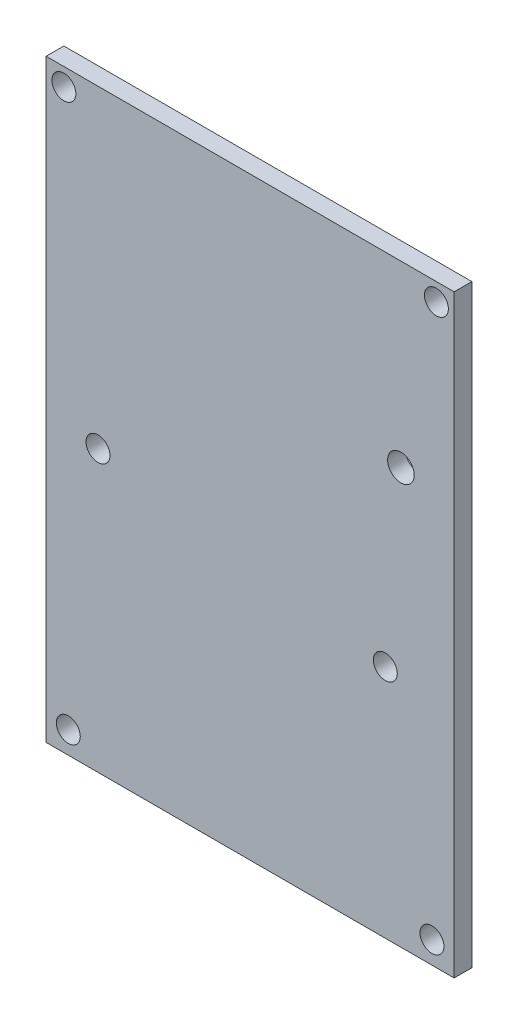
ISO-10303-21;
HEADER;
FILE_DESCRIPTION(('STEP AP214'),'2;1');
FILE_NAME('part.step','',(''),(''),'','','');
FILE_SCHEMA(('AUTOMOTIVE_DESIGN { 1 0 10303 214 1 1 1 1 }'));
ENDSEC;
DATA;
#1=APPLICATION_CONTEXT('core data for automotive mechanical design processes');
#2=APPLICATION_PROTOCOL_DEFINITION('international standard','automotive_design',2000,#1);
#3=PRODUCT_CONTEXT('',#1,'mechanical');
#4=PRODUCT('Part','Part','',(#3));
#5=PRODUCT_RELATED_PRODUCT_CATEGORY('part','',(#4));
#6=PRODUCT_DEFINITION_FORMATION('','',#4);
#7=PRODUCT_DEFINITION_CONTEXT('part definition',#1,'design');
#8=PRODUCT_DEFINITION('design','',#6,#7);
#9=PRODUCT_DEFINITION_SHAPE('','',#8);
#10=(LENGTH_UNIT() NAMED_UNIT(*) SI_UNIT(.MILLI.,.METRE.));
#11=(NAMED_UNIT(*) PLANE_ANGLE_UNIT() SI_UNIT($,.RADIAN.));
#12=(NAMED_UNIT(*) SI_UNIT($,.STERADIAN.) SOLID_ANGLE_UNIT());
#13=UNCERTAINTY_MEASURE_WITH_UNIT(LENGTH_MEASURE(1.E-05),#10,'distance_accuracy_value','');
#14=(GEOMETRIC_REPRESENTATION_CONTEXT(3) GLOBAL_UNCERTAINTY_ASSIGNED_CONTEXT((#13)) GLOBAL_UNIT_ASSIGNED_CONTEXT((#10,
#11,#12)) REPRESENTATION_CONTEXT('',''));
#15=CARTESIAN_POINT('',(0.,0.,0.));
#16=DIRECTION('',(0.,0.,1.));
#17=DIRECTION('',(1.,0.,0.));
#18=AXIS2_PLACEMENT_3D('',#15,#16,#17);
#19=CARTESIAN_POINT('',(23.,-33.5,2.));
#20=DIRECTION('',(-1.,0.,0.));
#21=DIRECTION('',(0.,0.,1.));
#22=AXIS2_PLACEMENT_3D('',#19,#20,#21);
#23=PLANE('',#22);
#24=DIRECTION('',(0.,1.,0.));
#25=VECTOR('',#24,1.);
#26=CARTESIAN_POINT('',(23.,-33.5,0.));
#27=LINE('',#26,#25);
#28=CARTESIAN_POINT('',(23.,-33.5,0.));
#29=VERTEX_POINT('',#28);
#30=CARTESIAN_POINT('',(23.,33.5,0.));
#31=VERTEX_POINT('',#30);
#32=EDGE_CURVE('E99',#29,#31,#27,.T.);
#33=ORIENTED_EDGE('',*,*,#32,.T.);
#34=DIRECTION('',(0.,0.,-1.));
#35=VECTOR('',#34,1.);
#36=CARTESIAN_POINT('',(23.,33.5,2.));
#37=LINE('',#36,#35);
#38=CARTESIAN_POINT('',(23.,33.5,2.));
#39=VERTEX_POINT('',#38);
#40=EDGE_CURVE('E11',#39,#31,#37,.T.);
#41=ORIENTED_EDGE('',*,*,#40,.F.);
#42=DIRECTION('',(0.,1.,0.));
#43=VECTOR('',#42,1.);
#44=CARTESIAN_POINT('',(23.,-33.5,2.));
#45=LINE('',#44,#43);
#46=CARTESIAN_POINT('',(23.,-33.5,2.));
#47=VERTEX_POINT('',#46);
#48=EDGE_CURVE('E87',#47,#39,#45,.T.);
#49=ORIENTED_EDGE('',*,*,#48,.F.);
#50=DIRECTION('',(0.,0.,-1.));
#51=VECTOR('',#50,1.);
#52=CARTESIAN_POINT('',(23.,-33.5,2.));
#53=LINE('',#52,#51);
#54=EDGE_CURVE('E95',#47,#29,#53,.T.);
#55=ORIENTED_EDGE('',*,*,#54,.T.);
#56=EDGE_LOOP('',(#33,#41,#49,#55));
#57=FACE_BOUND('',#56,.T.);
#58=ADVANCED_FACE('F36',(#57),#23,.F.);
#59=CARTESIAN_POINT('',(-23.,33.5,2.));
#60=DIRECTION('',(0.,-1.,0.));
#61=DIRECTION('',(0.,0.,-1.));
#62=AXIS2_PLACEMENT_3D('',#59,#60,#61);
#63=PLANE('',#62);
#64=DIRECTION('',(-1.,0.,0.));
#65=VECTOR('',#64,1.);
#66=CARTESIAN_POINT('',(-23.,33.5,0.));
#67=LINE('',#66,#65);
#68=CARTESIAN_POINT('',(-23.,33.5,0.));
#69=VERTEX_POINT('',#68);
#70=EDGE_CURVE('E91',#31,#69,#67,.T.);
#71=ORIENTED_EDGE('',*,*,#70,.T.);
#72=DIRECTION('',(0.,0.,-1.));
#73=VECTOR('',#72,1.);
#74=CARTESIAN_POINT('',(-23.,33.5,2.));
#75=LINE('',#74,#73);
#76=CARTESIAN_POINT('',(-23.,33.5,2.));
#77=VERTEX_POINT('',#76);
#78=EDGE_CURVE('E44',#77,#69,#75,.T.);
#79=ORIENTED_EDGE('',*,*,#78,.F.);
#80=DIRECTION('',(-1.,0.,0.));
#81=VECTOR('',#80,1.);
#82=CARTESIAN_POINT('',(-23.,33.5,2.));
#83=LINE('',#82,#81);
#84=EDGE_CURVE('E82',#39,#77,#83,.T.);
#85=ORIENTED_EDGE('',*,*,#84,.F.);
#86=ORIENTED_EDGE('',*,*,#40,.T.);
#87=EDGE_LOOP('',(#71,#79,#85,#86));
#88=FACE_BOUND('',#87,.T.);
#89=ADVANCED_FACE('F90',(#88),#63,.F.);
#90=CARTESIAN_POINT('',(-23.,-33.5,2.));
#91=DIRECTION('',(1.,0.,0.));
#92=DIRECTION('',(0.,0.,-1.));
#93=AXIS2_PLACEMENT_3D('',#90,#91,#92);
#94=PLANE('',#93);
#95=DIRECTION('',(0.,-1.,0.));
#96=VECTOR('',#95,1.);
#97=CARTESIAN_POINT('',(-23.,-33.5,0.));
#98=LINE('',#97,#96);
#99=CARTESIAN_POINT('',(-23.,-33.5,0.));
#100=VERTEX_POINT('',#99);
#101=EDGE_CURVE('E69',#69,#100,#98,.T.);
#102=ORIENTED_EDGE('',*,*,#101,.T.);
#103=DIRECTION('',(0.,0.,-1.));
#104=VECTOR('',#103,1.);
#105=CARTESIAN_POINT('',(-23.,-33.5,2.));
#106=LINE('',#105,#104);
#107=CARTESIAN_POINT('',(-23.,-33.5,2.));
#108=VERTEX_POINT('',#107);
#109=EDGE_CURVE('E92',#108,#100,#106,.T.);
#110=ORIENTED_EDGE('',*,*,#109,.F.);
#111=DIRECTION('',(0.,-1.,0.));
#112=VECTOR('',#111,1.);
#113=CARTESIAN_POINT('',(-23.,-33.5,2.));
#114=LINE('',#113,#112);
#115=EDGE_CURVE('E85',#77,#108,#114,.T.);
#116=ORIENTED_EDGE('',*,*,#115,.F.);
#117=ORIENTED_EDGE('',*,*,#78,.T.);
#118=EDGE_LOOP('',(#102,#110,#116,#117));
#119=FACE_BOUND('',#118,.T.);
#120=ADVANCED_FACE('F93',(#119),#94,.F.);
#121=CARTESIAN_POINT('',(-23.,-33.5,2.));
#122=DIRECTION('',(0.,1.,0.));
#123=DIRECTION('',(0.,0.,1.));
#124=AXIS2_PLACEMENT_3D('',#121,#122,#123);
#125=PLANE('',#124);
#126=DIRECTION('',(1.,0.,0.));
#127=VECTOR('',#126,1.);
#128=CARTESIAN_POINT('',(-23.,-33.5,0.));
#129=LINE('',#128,#127);
#130=EDGE_CURVE('E75',#100,#29,#129,.T.);
#131=ORIENTED_EDGE('',*,*,#130,.T.);
#132=ORIENTED_EDGE('',*,*,#54,.F.);
#133=DIRECTION('',(1.,0.,0.));
#134=VECTOR('',#133,1.);
#135=CARTESIAN_POINT('',(-23.,-33.5,2.));
#136=LINE('',#135,#134);
#137=EDGE_CURVE('E52',#108,#47,#136,.T.);
#138=ORIENTED_EDGE('',*,*,#137,.F.);
#139=ORIENTED_EDGE('',*,*,#109,.T.);
#140=EDGE_LOOP('',(#131,#132,#138,#139));
#141=FACE_BOUND('',#140,.T.);
#142=ADVANCED_FACE('F107',(#141),#125,.F.);
#143=CARTESIAN_POINT('',(0.,0.,2.));
#144=DIRECTION('',(0.,0.,-1.));
#145=DIRECTION('',(-1.,0.,0.));
#146=AXIS2_PLACEMENT_3D('',#143,#144,#145);
#147=PLANE('',#146);
#148=CARTESIAN_POINT('',(17.,13.345,2.));
#149=DIRECTION('',(0.,0.,1.));
#150=DIRECTION('',(1.,0.,0.));
#151=AXIS2_PLACEMENT_3D('',#148,#149,#150);
#152=CIRCLE('',#151,1.5);
#153=CARTESIAN_POINT('',(18.5,13.345,2.));
#154=VERTEX_POINT('',#153);
#155=EDGE_CURVE('E151',#154,#154,#152,.T.);
#156=ORIENTED_EDGE('',*,*,#155,.F.);
#157=EDGE_LOOP('',(#156));
#158=FACE_BOUND('',#157,.T.);
#159=CARTESIAN_POINT('',(-21.,31.5,2.));
#160=DIRECTION('',(0.,0.,1.));
#161=DIRECTION('',(1.,0.,0.));
#162=AXIS2_PLACEMENT_3D('',#159,#160,#161);
#163=CIRCLE('',#162,1.35);
#164=CARTESIAN_POINT('',(-19.65,31.5,2.));
#165=VERTEX_POINT('',#164);
#166=EDGE_CURVE('E145',#165,#165,#163,.T.);
#167=ORIENTED_EDGE('',*,*,#166,.F.);
#168=EDGE_LOOP('',(#167));
#169=FACE_BOUND('',#168,.T.);
#170=CARTESIAN_POINT('',(21.,31.5,2.));
#171=DIRECTION('',(0.,0.,1.));
#172=DIRECTION('',(1.,0.,0.));
#173=AXIS2_PLACEMENT_3D('',#170,#171,#172);
#174=CIRCLE('',#173,1.35);
#175=CARTESIAN_POINT('',(22.35,31.5,2.));
#176=VERTEX_POINT('',#175);
#177=EDGE_CURVE('E139',#176,#176,#174,.T.);
#178=ORIENTED_EDGE('',*,*,#177,.F.);
#179=EDGE_LOOP('',(#178));
#180=FACE_BOUND('',#179,.T.);
#181=CARTESIAN_POINT('',(20.5,-31.,2.));
#182=DIRECTION('',(0.,0.,1.));
#183=DIRECTION('',(1.,0.,0.));
#184=AXIS2_PLACEMENT_3D('',#181,#182,#183);
#185=CIRCLE('',#184,1.35);
#186=CARTESIAN_POINT('',(21.85,-31.,2.));
#187=VERTEX_POINT('',#186);
#188=EDGE_CURVE('E133',#187,#187,#185,.T.);
#189=ORIENTED_EDGE('',*,*,#188,.F.);
#190=EDGE_LOOP('',(#189));
#191=FACE_BOUND('',#190,.T.);
#192=CARTESIAN_POINT('',(-20.5,-31.,2.));
#193=DIRECTION('',(0.,0.,1.));
#194=DIRECTION('',(1.,0.,0.));
#195=AXIS2_PLACEMENT_3D('',#192,#193,#194);
#196=CIRCLE('',#195,1.35);
#197=CARTESIAN_POINT('',(-19.15,-31.,2.));
#198=VERTEX_POINT('',#197);
#199=EDGE_CURVE('E127',#198,#198,#196,.T.);
#200=ORIENTED_EDGE('',*,*,#199,.F.);
#201=EDGE_LOOP('',(#200));
#202=FACE_BOUND('',#201,.T.);
#203=CARTESIAN_POINT('',(-17.155,-1.895,2.));
#204=DIRECTION('',(0.,0.,1.));
#205=DIRECTION('',(1.,0.,0.));
#206=AXIS2_PLACEMENT_3D('',#203,#204,#205);
#207=CIRCLE('',#206,1.35);
#208=CARTESIAN_POINT('',(-15.805,-1.895,2.));
#209=VERTEX_POINT('',#208);
#210=EDGE_CURVE('E121',#209,#209,#207,.T.);
#211=ORIENTED_EDGE('',*,*,#210,.F.);
#212=EDGE_LOOP('',(#211));
#213=FACE_BOUND('',#212,.T.);
#214=CARTESIAN_POINT('',(15.24,-6.985,2.));
#215=DIRECTION('',(0.,0.,1.));
#216=DIRECTION('',(1.,0.,0.));
#217=AXIS2_PLACEMENT_3D('',#214,#215,#216);
#218=CIRCLE('',#217,1.35);
#219=CARTESIAN_POINT('',(16.59,-6.985,2.));
#220=VERTEX_POINT('',#219);
#221=EDGE_CURVE('E115',#220,#220,#218,.T.);
#222=ORIENTED_EDGE('',*,*,#221,.F.);
#223=EDGE_LOOP('',(#222));
#224=FACE_BOUND('',#223,.T.);
#225=ORIENTED_EDGE('',*,*,#48,.T.);
#226=ORIENTED_EDGE('',*,*,#84,.T.);
#227=ORIENTED_EDGE('',*,*,#115,.T.);
#228=ORIENTED_EDGE('',*,*,#137,.T.);
#229=EDGE_LOOP('',(#225,#226,#227,#228));
#230=FACE_BOUND('',#229,.T.);
#231=ADVANCED_FACE('F83',(#158,#169,#180,#191,#202,#213,#224,#230),#147,.F.);
#232=CARTESIAN_POINT('',(0.,0.,0.));
#233=DIRECTION('',(0.,0.,-1.));
#234=DIRECTION('',(-1.,0.,0.));
#235=AXIS2_PLACEMENT_3D('',#232,#233,#234);
#236=PLANE('',#235);
#237=CARTESIAN_POINT('',(17.,13.345,0.));
#238=DIRECTION('',(0.,0.,1.));
#239=DIRECTION('',(1.,0.,0.));
#240=AXIS2_PLACEMENT_3D('',#237,#238,#239);
#241=CIRCLE('',#240,1.5);
#242=CARTESIAN_POINT('',(18.5,13.345,0.));
#243=VERTEX_POINT('',#242);
#244=EDGE_CURVE('E148',#243,#243,#241,.T.);
#245=ORIENTED_EDGE('',*,*,#244,.T.);
#246=EDGE_LOOP('',(#245));
#247=FACE_BOUND('',#246,.T.);
#248=CARTESIAN_POINT('',(-21.,31.5,0.));
#249=DIRECTION('',(0.,0.,1.));
#250=DIRECTION('',(1.,0.,0.));
#251=AXIS2_PLACEMENT_3D('',#248,#249,#250);
#252=CIRCLE('',#251,1.35);
#253=CARTESIAN_POINT('',(-19.65,31.5,0.));
#254=VERTEX_POINT('',#253);
#255=EDGE_CURVE('E142',#254,#254,#252,.T.);
#256=ORIENTED_EDGE('',*,*,#255,.T.);
#257=EDGE_LOOP('',(#256));
#258=FACE_BOUND('',#257,.T.);
#259=CARTESIAN_POINT('',(21.,31.5,0.));
#260=DIRECTION('',(0.,0.,1.));
#261=DIRECTION('',(1.,0.,0.));
#262=AXIS2_PLACEMENT_3D('',#259,#260,#261);
#263=CIRCLE('',#262,1.35);
#264=CARTESIAN_POINT('',(22.35,31.5,0.));
#265=VERTEX_POINT('',#264);
#266=EDGE_CURVE('E136',#265,#265,#263,.T.);
#267=ORIENTED_EDGE('',*,*,#266,.T.);
#268=EDGE_LOOP('',(#267));
#269=FACE_BOUND('',#268,.T.);
#270=CARTESIAN_POINT('',(20.5,-31.,0.));
#271=DIRECTION('',(0.,0.,1.));
#272=DIRECTION('',(1.,0.,0.));
#273=AXIS2_PLACEMENT_3D('',#270,#271,#272);
#274=CIRCLE('',#273,1.35);
#275=CARTESIAN_POINT('',(21.85,-31.,0.));
#276=VERTEX_POINT('',#275);
#277=EDGE_CURVE('E130',#276,#276,#274,.T.);
#278=ORIENTED_EDGE('',*,*,#277,.T.);
#279=EDGE_LOOP('',(#278));
#280=FACE_BOUND('',#279,.T.);
#281=CARTESIAN_POINT('',(-20.5,-31.,0.));
#282=DIRECTION('',(0.,0.,1.));
#283=DIRECTION('',(1.,0.,0.));
#284=AXIS2_PLACEMENT_3D('',#281,#282,#283);
#285=CIRCLE('',#284,1.35);
#286=CARTESIAN_POINT('',(-19.15,-31.,0.));
#287=VERTEX_POINT('',#286);
#288=EDGE_CURVE('E124',#287,#287,#285,.T.);
#289=ORIENTED_EDGE('',*,*,#288,.T.);
#290=EDGE_LOOP('',(#289));
#291=FACE_BOUND('',#290,.T.);
#292=CARTESIAN_POINT('',(-17.155,-1.895,0.));
#293=DIRECTION('',(0.,0.,1.));
#294=DIRECTION('',(1.,0.,0.));
#295=AXIS2_PLACEMENT_3D('',#292,#293,#294);
#296=CIRCLE('',#295,1.35);
#297=CARTESIAN_POINT('',(-15.805,-1.895,0.));
#298=VERTEX_POINT('',#297);
#299=EDGE_CURVE('E118',#298,#298,#296,.T.);
#300=ORIENTED_EDGE('',*,*,#299,.T.);
#301=EDGE_LOOP('',(#300));
#302=FACE_BOUND('',#301,.T.);
#303=CARTESIAN_POINT('',(15.24,-6.985,0.));
#304=DIRECTION('',(0.,0.,1.));
#305=DIRECTION('',(1.,0.,0.));
#306=AXIS2_PLACEMENT_3D('',#303,#304,#305);
#307=CIRCLE('',#306,1.35);
#308=CARTESIAN_POINT('',(16.59,-6.985,0.));
#309=VERTEX_POINT('',#308);
#310=EDGE_CURVE('E102',#309,#309,#307,.T.);
#311=ORIENTED_EDGE('',*,*,#310,.T.);
#312=EDGE_LOOP('',(#311));
#313=FACE_BOUND('',#312,.T.);
#314=ORIENTED_EDGE('',*,*,#32,.F.);
#315=ORIENTED_EDGE('',*,*,#130,.F.);
#316=ORIENTED_EDGE('',*,*,#101,.F.);
#317=ORIENTED_EDGE('',*,*,#70,.F.);
#318=EDGE_LOOP('',(#314,#315,#316,#317));
#319=FACE_BOUND('',#318,.T.);
#320=ADVANCED_FACE('F110',(#247,#258,#269,#280,#291,#302,#313,#319),#236,.T.);
#321=CARTESIAN_POINT('',(15.24,-6.985,2.));
#322=DIRECTION('',(0.,0.,1.));
#323=DIRECTION('',(1.,0.,0.));
#324=AXIS2_PLACEMENT_3D('',#321,#322,#323);
#325=CYLINDRICAL_SURFACE('',#324,1.35);
#326=ORIENTED_EDGE('',*,*,#310,.F.);
#327=EDGE_LOOP('',(#326));
#328=FACE_BOUND('',#327,.T.);
#329=ORIENTED_EDGE('',*,*,#221,.T.);
#330=EDGE_LOOP('',(#329));
#331=FACE_BOUND('',#330,.T.);
#332=ADVANCED_FACE('F172',(#328,#331),#325,.F.);
#333=CARTESIAN_POINT('',(-17.155,-1.895,2.));
#334=DIRECTION('',(0.,0.,1.));
#335=DIRECTION('',(1.,0.,0.));
#336=AXIS2_PLACEMENT_3D('',#333,#334,#335);
#337=CYLINDRICAL_SURFACE('',#336,1.35);
#338=ORIENTED_EDGE('',*,*,#299,.F.);
#339=EDGE_LOOP('',(#338));
#340=FACE_BOUND('',#339,.T.);
#341=ORIENTED_EDGE('',*,*,#210,.T.);
#342=EDGE_LOOP('',(#341));
#343=FACE_BOUND('',#342,.T.);
#344=ADVANCED_FACE('F174',(#340,#343),#337,.F.);
#345=CARTESIAN_POINT('',(-20.5,-31.,2.));
#346=DIRECTION('',(0.,0.,1.));
#347=DIRECTION('',(1.,0.,0.));
#348=AXIS2_PLACEMENT_3D('',#345,#346,#347);
#349=CYLINDRICAL_SURFACE('',#348,1.35);
#350=ORIENTED_EDGE('',*,*,#288,.F.);
#351=EDGE_LOOP('',(#350));
#352=FACE_BOUND('',#351,.T.);
#353=ORIENTED_EDGE('',*,*,#199,.T.);
#354=EDGE_LOOP('',(#353));
#355=FACE_BOUND('',#354,.T.);
#356=ADVANCED_FACE('F181',(#352,#355),#349,.F.);
#357=CARTESIAN_POINT('',(20.5,-31.,2.));
#358=DIRECTION('',(0.,0.,1.));
#359=DIRECTION('',(1.,0.,0.));
#360=AXIS2_PLACEMENT_3D('',#357,#358,#359);
#361=CYLINDRICAL_SURFACE('',#360,1.35);
#362=ORIENTED_EDGE('',*,*,#277,.F.);
#363=EDGE_LOOP('',(#362));
#364=FACE_BOUND('',#363,.T.);
#365=ORIENTED_EDGE('',*,*,#188,.T.);
#366=EDGE_LOOP('',(#365));
#367=FACE_BOUND('',#366,.T.);
#368=ADVANCED_FACE('F236',(#364,#367),#361,.F.);
#369=CARTESIAN_POINT('',(21.,31.5,2.));
#370=DIRECTION('',(0.,0.,1.));
#371=DIRECTION('',(1.,0.,0.));
#372=AXIS2_PLACEMENT_3D('',#369,#370,#371);
#373=CYLINDRICAL_SURFACE('',#372,1.35);
#374=ORIENTED_EDGE('',*,*,#266,.F.);
#375=EDGE_LOOP('',(#374));
#376=FACE_BOUND('',#375,.T.);
#377=ORIENTED_EDGE('',*,*,#177,.T.);
#378=EDGE_LOOP('',(#377));
#379=FACE_BOUND('',#378,.T.);
#380=ADVANCED_FACE('F229',(#376,#379),#373,.F.);
#381=CARTESIAN_POINT('',(-21.,31.5,2.));
#382=DIRECTION('',(0.,0.,1.));
#383=DIRECTION('',(1.,0.,0.));
#384=AXIS2_PLACEMENT_3D('',#381,#382,#383);
#385=CYLINDRICAL_SURFACE('',#384,1.35);
#386=ORIENTED_EDGE('',*,*,#255,.F.);
#387=EDGE_LOOP('',(#386));
#388=FACE_BOUND('',#387,.T.);
#389=ORIENTED_EDGE('',*,*,#166,.T.);
#390=EDGE_LOOP('',(#389));
#391=FACE_BOUND('',#390,.T.);
#392=ADVANCED_FACE('F219',(#388,#391),#385,.F.);
#393=CARTESIAN_POINT('',(17.,13.345,2.));
#394=DIRECTION('',(0.,0.,1.));
#395=DIRECTION('',(1.,0.,0.));
#396=AXIS2_PLACEMENT_3D('',#393,#394,#395);
#397=CYLINDRICAL_SURFACE('',#396,1.5);
#398=ORIENTED_EDGE('',*,*,#244,.F.);
#399=EDGE_LOOP('',(#398));
#400=FACE_BOUND('',#399,.T.);
#401=ORIENTED_EDGE('',*,*,#155,.T.);
#402=EDGE_LOOP('',(#401));
#403=FACE_BOUND('',#402,.T.);
#404=ADVANCED_FACE('F155',(#400,#403),#397,.F.);
#405=CLOSED_SHELL('',(#58,#89,#120,#142,#231,#320,#332,#344,#356,#368,#380,#392,#404));
#406=MANIFOLD_SOLID_BREP('B2',#405);
#407=ADVANCED_BREP_SHAPE_REPRESENTATION('',(#18,#406),#14);
#408=SHAPE_DEFINITION_REPRESENTATION(#9,#407);
ENDSEC;
END-ISO-10303-21;
